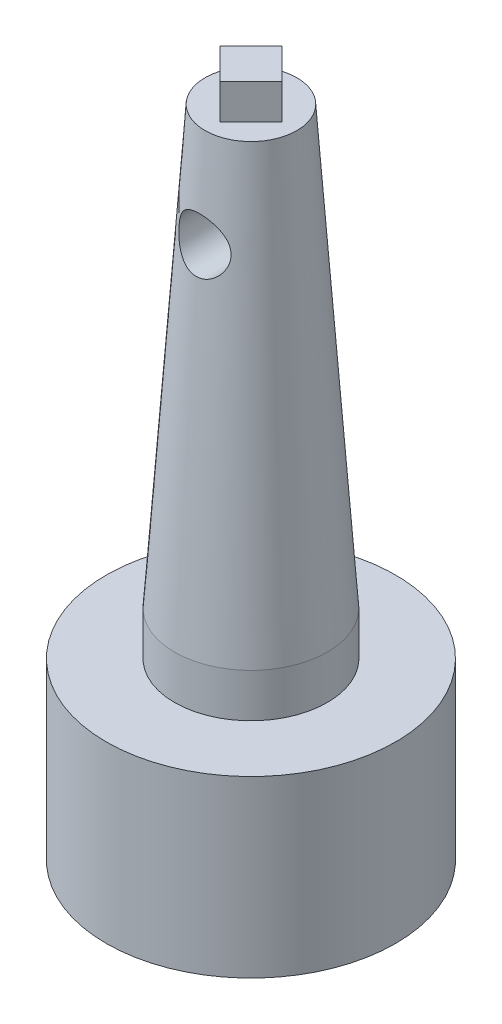
ISO-10303-21;
HEADER;
FILE_DESCRIPTION(('STEP AP214'),'2;1');
FILE_NAME('part.step','',(''),(''),'','','');
FILE_SCHEMA(('AUTOMOTIVE_DESIGN { 1 0 10303 214 1 1 1 1 }'));
ENDSEC;
DATA;
#1=APPLICATION_CONTEXT('core data for automotive mechanical design processes');
#2=APPLICATION_PROTOCOL_DEFINITION('international standard','automotive_design',2000,#1);
#3=PRODUCT_CONTEXT('',#1,'mechanical');
#4=PRODUCT('Part','Part','',(#3));
#5=PRODUCT_RELATED_PRODUCT_CATEGORY('part','',(#4));
#6=PRODUCT_DEFINITION_FORMATION('','',#4);
#7=PRODUCT_DEFINITION_CONTEXT('part definition',#1,'design');
#8=PRODUCT_DEFINITION('design','',#6,#7);
#9=PRODUCT_DEFINITION_SHAPE('','',#8);
#10=(LENGTH_UNIT() NAMED_UNIT(*) SI_UNIT(.MILLI.,.METRE.));
#11=(NAMED_UNIT(*) PLANE_ANGLE_UNIT() SI_UNIT($,.RADIAN.));
#12=(NAMED_UNIT(*) SI_UNIT($,.STERADIAN.) SOLID_ANGLE_UNIT());
#13=UNCERTAINTY_MEASURE_WITH_UNIT(LENGTH_MEASURE(1.E-05),#10,'distance_accuracy_value','');
#14=(GEOMETRIC_REPRESENTATION_CONTEXT(3) GLOBAL_UNCERTAINTY_ASSIGNED_CONTEXT((#13)) GLOBAL_UNIT_ASSIGNED_CONTEXT((#10,
#11,#12)) REPRESENTATION_CONTEXT('',''));
#15=CARTESIAN_POINT('',(0.,0.,0.));
#16=DIRECTION('',(0.,0.,1.));
#17=DIRECTION('',(1.,0.,0.));
#18=AXIS2_PLACEMENT_3D('',#15,#16,#17);
#19=CARTESIAN_POINT('',(0.,40.,0.));
#20=DIRECTION('',(0.,-1.,0.));
#21=DIRECTION('',(0.,0.,-1.));
#22=AXIS2_PLACEMENT_3D('',#19,#20,#21);
#23=CYLINDRICAL_SURFACE('',#22,33.14);
#24=CARTESIAN_POINT('',(0.,40.,0.));
#25=DIRECTION('',(0.,1.,0.));
#26=DIRECTION('',(0.,0.,1.));
#27=AXIS2_PLACEMENT_3D('',#24,#25,#26);
#28=CIRCLE('',#27,33.14);
#29=CARTESIAN_POINT('',(0.,40.,33.14));
#30=VERTEX_POINT('',#29);
#31=EDGE_CURVE('E11',#30,#30,#28,.T.);
#32=ORIENTED_EDGE('',*,*,#31,.F.);
#33=EDGE_LOOP('',(#32));
#34=FACE_BOUND('',#33,.T.);
#35=CARTESIAN_POINT('',(0.,0.,0.));
#36=DIRECTION('',(0.,1.,0.));
#37=DIRECTION('',(0.,0.,1.));
#38=AXIS2_PLACEMENT_3D('',#35,#36,#37);
#39=CIRCLE('',#38,33.14);
#40=CARTESIAN_POINT('',(0.,0.,33.14));
#41=VERTEX_POINT('',#40);
#42=EDGE_CURVE('E49',#41,#41,#39,.T.);
#43=ORIENTED_EDGE('',*,*,#42,.T.);
#44=EDGE_LOOP('',(#43));
#45=FACE_BOUND('',#44,.T.);
#46=ADVANCED_FACE('F36',(#34,#45),#23,.T.);
#47=CARTESIAN_POINT('',(0.,40.,0.));
#48=DIRECTION('',(0.,1.,0.));
#49=DIRECTION('',(0.,0.,1.));
#50=AXIS2_PLACEMENT_3D('',#47,#48,#49);
#51=PLANE('',#50);
#52=CARTESIAN_POINT('',(0.,40.,0.));
#53=DIRECTION('',(0.,1.,0.));
#54=DIRECTION('',(0.,0.,1.));
#55=AXIS2_PLACEMENT_3D('',#52,#53,#54);
#56=CIRCLE('',#55,17.5);
#57=CARTESIAN_POINT('',(0.,40.,17.5));
#58=VERTEX_POINT('',#57);
#59=EDGE_CURVE('E114',#58,#58,#56,.T.);
#60=ORIENTED_EDGE('',*,*,#59,.F.);
#61=EDGE_LOOP('',(#60));
#62=FACE_BOUND('',#61,.T.);
#63=ORIENTED_EDGE('',*,*,#31,.T.);
#64=EDGE_LOOP('',(#63));
#65=FACE_BOUND('',#64,.T.);
#66=ADVANCED_FACE('F155',(#62,#65),#51,.T.);
#67=CARTESIAN_POINT('',(0.,0.,0.));
#68=DIRECTION('',(0.,1.,0.));
#69=DIRECTION('',(1.,0.,0.));
#70=AXIS2_PLACEMENT_3D('',#67,#68,#69);
#71=SPHERICAL_SURFACE('',#70,33.14);
#72=ORIENTED_EDGE('',*,*,#42,.F.);
#73=EDGE_LOOP('',(#72));
#74=FACE_BOUND('',#73,.T.);
#75=ADVANCED_FACE('F160',(#74),#71,.F.);
#76=CARTESIAN_POINT('',(0.,-0.002000000000002,0.));
#77=DIRECTION('',(0.,1.,0.));
#78=DIRECTION('',(0.,0.,1.));
#79=AXIS2_PLACEMENT_3D('',#76,#77,#78);
#80=CYLINDRICAL_SURFACE('',#79,17.5);
#81=ORIENTED_EDGE('',*,*,#59,.T.);
#82=EDGE_LOOP('',(#81));
#83=FACE_BOUND('',#82,.T.);
#84=CARTESIAN_POINT('',(0.,50.,0.));
#85=DIRECTION('',(0.,1.,0.));
#86=DIRECTION('',(0.,0.,1.));
#87=AXIS2_PLACEMENT_3D('',#84,#85,#86);
#88=CIRCLE('',#87,17.5);
#89=CARTESIAN_POINT('',(0.,50.,17.5));
#90=VERTEX_POINT('',#89);
#91=EDGE_CURVE('E106',#90,#90,#88,.T.);
#92=ORIENTED_EDGE('',*,*,#91,.F.);
#93=EDGE_LOOP('',(#92));
#94=FACE_BOUND('',#93,.T.);
#95=ADVANCED_FACE('F151',(#83,#94),#80,.T.);
#96=CARTESIAN_POINT('',(0.,50.,0.));
#97=DIRECTION('',(0.,-1.,0.));
#98=DIRECTION('',(0.,0.,1.));
#99=AXIS2_PLACEMENT_3D('',#96,#97,#98);
#100=CONICAL_SURFACE('',#99,17.5,0.0698131700797732);
#101=CARTESIAN_POINT('',(-4.43018311927969,124.047940024082,-11.4981185183558));
#102=CARTESIAN_POINT('',(-4.21073559248368,123.798132972739,-11.6013875806402));
#103=CARTESIAN_POINT('',(-3.97022466613334,123.566076499891,-11.7037941893067));
#104=CARTESIAN_POINT('',(-3.45097271458993,123.142821609395,-11.8980823101804));
#105=CARTESIAN_POINT('',(-3.17217410149361,122.951685869632,-11.9899475778646));
#106=CARTESIAN_POINT('',(-2.72927569503452,122.70031611798,-12.113599200864));
#107=CARTESIAN_POINT('',(-2.5770652888357,122.622246723629,-12.1525476624292));
#108=CARTESIAN_POINT('',(-2.2654374033476,122.478924228766,-12.2246651444194));
#109=CARTESIAN_POINT('',(-2.10602315775809,122.413665446693,-12.2578367261747));
#110=CARTESIAN_POINT('',(-1.7812037497238,122.296794342125,-12.3174884237892));
#111=CARTESIAN_POINT('',(-1.61580353184301,122.24517103627,-12.343973924513));
#112=CARTESIAN_POINT('',(-1.28020591579924,122.156214282065,-12.3895299784509));
#113=CARTESIAN_POINT('',(-1.11000907388733,122.118879184014,-12.4086013876925));
#114=CARTESIAN_POINT('',(-0.781442663501435,122.061694429336,-12.4374241228269));
#115=CARTESIAN_POINT('',(-0.623348266304433,122.040596402695,-12.4478472573004));
#116=CARTESIAN_POINT('',(-0.305682799581043,122.011042245575,-12.4617623036499));
#117=CARTESIAN_POINT('',(-0.14611184389465,122.002585148543,-12.4652547454695));
#118=CARTESIAN_POINT('',(0.173158654936147,121.998430893762,-12.4651986146649));
#119=CARTESIAN_POINT('',(0.332858162580136,122.002730962161,-12.4616515727251));
#120=CARTESIAN_POINT('',(0.651095594138211,122.024024448348,-12.4475903108619));
#121=CARTESIAN_POINT('',(0.809633553593091,122.041017476108,-12.4370763050199));
#122=CARTESIAN_POINT('',(1.11313564629887,122.085816113205,-12.4103122499686));
#123=CARTESIAN_POINT('',(1.2582669079616,122.112772198035,-12.3945203672401));
#124=CARTESIAN_POINT('',(1.54552197419558,122.177145223612,-12.3574517569853));
#125=CARTESIAN_POINT('',(1.6876448137705,122.214565467794,-12.3361732975641));
#126=CARTESIAN_POINT('',(1.96793457495759,122.299457904298,-12.2885622900804));
#127=CARTESIAN_POINT('',(2.10610260576038,122.346927246195,-12.2622311753995));
#128=CARTESIAN_POINT('',(2.37782491483698,122.451488366365,-12.2050022820996));
#129=CARTESIAN_POINT('',(2.51137737649492,122.508583882527,-12.1741027301098));
#130=CARTESIAN_POINT('',(2.7794843788718,122.634873865146,-12.1067165702524));
#131=CARTESIAN_POINT('',(2.91377735939848,122.704518624279,-12.070032544399));
#132=CARTESIAN_POINT('',(3.17592803999881,122.853269265847,-11.992962050188));
#133=CARTESIAN_POINT('',(3.30378351880524,122.932378382611,-11.9525743172414));
#134=CARTESIAN_POINT('',(3.67685543621524,123.1830481364,-11.8269481925208));
#135=CARTESIAN_POINT('',(3.911705898397,123.36801226569,-11.7372135029268));
#136=CARTESIAN_POINT('',(4.37559543857931,123.792787999697,-11.5411350044579));
#137=CARTESIAN_POINT('',(4.6007898909787,124.036475077642,-11.4340727329308));
#138=CARTESIAN_POINT('',(4.90632744759103,124.427482235784,-11.2747964186743));
#139=CARTESIAN_POINT('',(5.00285993823301,124.562178429875,-11.2218833011104));
#140=CARTESIAN_POINT('',(5.18472027375542,124.839596825431,-11.1176264531438));
#141=CARTESIAN_POINT('',(5.27004632978182,124.98232030309,-11.0662829742996));
#142=CARTESIAN_POINT('',(5.43402434797292,125.284577039565,-10.9631609319515));
#143=CARTESIAN_POINT('',(5.51189061988297,125.444600742747,-10.9115679889128));
#144=CARTESIAN_POINT('',(5.65349960426898,125.772080470128,-10.8130408902593));
#145=CARTESIAN_POINT('',(5.71724897958029,125.939532943139,-10.7661045426422));
#146=CARTESIAN_POINT('',(5.82985776785401,126.280803455469,-10.678365240841));
#147=CARTESIAN_POINT('',(5.87872812907922,126.454616708395,-10.6375577881568));
#148=CARTESIAN_POINT('',(5.96086660192151,126.807451257228,-10.5634298931085));
#149=CARTESIAN_POINT('',(5.9941372393062,126.986471705042,-10.5301082391663));
#150=CARTESIAN_POINT('',(6.04206450064619,127.331359668241,-10.4748380588139));
#151=CARTESIAN_POINT('',(6.05816332292635,127.496903916347,-10.4521205084956));
#152=CARTESIAN_POINT('',(6.07658891532129,127.829643808885,-10.4144901174232));
#153=CARTESIAN_POINT('',(6.0789165942709,127.99683934361,-10.3995767616859));
#154=CARTESIAN_POINT('',(6.06960708256829,128.331269481667,-10.3779303143371));
#155=CARTESIAN_POINT('',(6.0579785144845,128.498503997119,-10.3711921770121));
#156=CARTESIAN_POINT('',(6.02079582956152,128.831541062499,-10.3658993774439));
#157=CARTESIAN_POINT('',(5.99524270874028,128.997343713987,-10.3673441299511));
#158=CARTESIAN_POINT('',(5.93426626527174,129.306708290312,-10.3774431975523));
#159=CARTESIAN_POINT('',(5.90035070698604,129.450599407305,-10.3852327150515));
#160=CARTESIAN_POINT('',(5.82214989866593,129.735156397323,-10.4064799927191));
#161=CARTESIAN_POINT('',(5.7778612493861,129.875821196464,-10.419939612128));
#162=CARTESIAN_POINT('',(5.67930632195236,130.152985027352,-10.4519295795277));
#163=CARTESIAN_POINT('',(5.62504145516178,130.289484645179,-10.4704592104306));
#164=CARTESIAN_POINT('',(5.50693986685151,130.557642328649,-10.5118899189422));
#165=CARTESIAN_POINT('',(5.44309941444535,130.68929848215,-10.5347927013933));
#166=CARTESIAN_POINT('',(5.30329286047183,130.952759775901,-10.5852801558323));
#167=CARTESIAN_POINT('',(5.22691697950042,131.084316855838,-10.6130264280576));
#168=CARTESIAN_POINT('',(5.06475377232466,131.340796610155,-10.6715174210446));
#169=CARTESIAN_POINT('',(4.97896328591894,131.465717035798,-10.7022631482468));
#170=CARTESIAN_POINT('',(4.70812117091173,131.829768860132,-10.7976326521644));
#171=CARTESIAN_POINT('',(4.50953941216434,132.058302369856,-10.8654114612557));
#172=CARTESIAN_POINT('',(4.17574839579356,132.388540783482,-10.9717377010827));
#173=CARTESIAN_POINT('',(4.05137174156515,132.501624837259,-11.0099508597093));
#174=CARTESIAN_POINT('',(3.79339766715091,132.717049318047,-11.0855534886071));
#175=CARTESIAN_POINT('',(3.65980291619347,132.819392833672,-11.1229431932183));
#176=CARTESIAN_POINT('',(3.38403444351233,133.012726086905,-11.1958013316069));
#177=CARTESIAN_POINT('',(3.24185595808406,133.103709432432,-11.2312686774266));
#178=CARTESIAN_POINT('',(2.94983148649186,133.273566088008,-11.2992017897531));
#179=CARTESIAN_POINT('',(2.79998886184879,133.352444647556,-11.3316688549512));
#180=CARTESIAN_POINT('',(2.49152826584715,133.498394094987,-11.3930431548877));
#181=CARTESIAN_POINT('',(2.33282282175936,133.56530176334,-11.4218997717974));
#182=CARTESIAN_POINT('',(2.00956570471227,133.685368375414,-11.4746592918308));
#183=CARTESIAN_POINT('',(1.84501658074702,133.73853323192,-11.4985643244701));
#184=CARTESIAN_POINT('',(1.51130630339086,133.830540961827,-11.5406759068674));
#185=CARTESIAN_POINT('',(1.34214682752967,133.869388971791,-11.5588845000251));
#186=CARTESIAN_POINT('',(1.00055549829621,133.932309130005,-11.5890322515458));
#187=CARTESIAN_POINT('',(0.828123936736995,133.956382589562,-11.6009719662862));
#188=CARTESIAN_POINT('',(0.495374794213974,133.988120130966,-11.6175180827577));
#189=CARTESIAN_POINT('',(0.335192068423495,133.996943226798,-11.6226348795514));
#190=CARTESIAN_POINT('',(0.0145564894320367,134.001723300865,-11.6271234560717));
#191=CARTESIAN_POINT('',(-0.145896352240092,133.997680814967,-11.6264954750729));
#192=CARTESIAN_POINT('',(-0.465815939078724,133.976778087199,-11.6195390078705));
#193=CARTESIAN_POINT('',(-0.625282810112611,133.959919516952,-11.6132112650763));
#194=CARTESIAN_POINT('',(-0.942051773388804,133.913577160773,-11.5950667694413));
#195=CARTESIAN_POINT('',(-1.09935386728659,133.884093384496,-11.5832500207982));
#196=CARTESIAN_POINT('',(-1.40522601522624,133.814062673967,-11.5549948676314));
#197=CARTESIAN_POINT('',(-1.55390926802046,133.773937486059,-11.5387320399881));
#198=CARTESIAN_POINT('',(-1.84732050350019,133.682583991379,-11.5018772874439));
#199=CARTESIAN_POINT('',(-1.99204717948555,133.631352065208,-11.4812839514078));
#200=CARTESIAN_POINT('',(-2.27663530410905,133.518232961349,-11.4363209872401));
#201=CARTESIAN_POINT('',(-2.41649773844479,133.45634795772,-11.4119521297103));
#202=CARTESIAN_POINT('',(-2.69066629684865,133.322384604247,-11.3600675497925));
#203=CARTESIAN_POINT('',(-2.82497038408076,133.250302559744,-11.3325506874929));
#204=CARTESIAN_POINT('',(-3.23390361761907,133.010446071964,-11.2429272548991));
#205=CARTESIAN_POINT('',(-3.49784472134419,132.825662504237,-11.1764931414869));
#206=CARTESIAN_POINT('',(-3.99251907610382,132.416913174622,-11.0398926307856));
#207=CARTESIAN_POINT('',(-4.22322976888175,132.192921022617,-10.9697237420107));
#208=CARTESIAN_POINT('',(-4.54836113809761,131.822363909255,-10.8654428019121));
#209=CARTESIAN_POINT('',(-4.65640784994565,131.687999089761,-10.8296855803712));
#210=CARTESIAN_POINT('',(-4.86081600769238,131.410050903271,-10.7608200991121));
#211=CARTESIAN_POINT('',(-4.95718214088853,131.2664712697,-10.7277107786449));
#212=CARTESIAN_POINT('',(-5.13749759535808,130.970869295435,-10.6654836183469));
#213=CARTESIAN_POINT('',(-5.22144554605997,130.818846025375,-10.6363662191229));
#214=CARTESIAN_POINT('',(-5.37609858467498,130.507399564796,-10.5834734247126));
#215=CARTESIAN_POINT('',(-5.44681091897266,130.347980483432,-10.559695104995));
#216=CARTESIAN_POINT('',(-5.57165097065862,130.029541248666,-10.5195490310035));
#217=CARTESIAN_POINT('',(-5.62634249339461,129.870775914487,-10.5029160454464));
#218=CARTESIAN_POINT('',(-5.72227101259685,129.548740777481,-10.4766276889948));
#219=CARTESIAN_POINT('',(-5.76351490177528,129.385473328948,-10.4669687403986));
#220=CARTESIAN_POINT('',(-5.83208517269462,129.055883457894,-10.4553159615169));
#221=CARTESIAN_POINT('',(-5.85942115301497,128.88956322462,-10.4533168385429));
#222=CARTESIAN_POINT('',(-5.89993228564413,128.555310342843,-10.4573510630232));
#223=CARTESIAN_POINT('',(-5.91310882115365,128.387377853455,-10.4633836257533));
#224=CARTESIAN_POINT('',(-5.92456934924446,128.070480889589,-10.4823591881535));
#225=CARTESIAN_POINT('',(-5.92436754604184,127.921516719129,-10.4944445577637));
#226=CARTESIAN_POINT('',(-5.91290697518498,127.624593238485,-10.5247278237569));
#227=CARTESIAN_POINT('',(-5.90164465142896,127.476634266891,-10.5429276847906));
#228=CARTESIAN_POINT('',(-5.86829351154575,127.182735460413,-10.5850320206431));
#229=CARTESIAN_POINT('',(-5.84620255095941,127.036796031359,-10.6089376249228));
#230=CARTESIAN_POINT('',(-5.79153501795798,126.747821462503,-10.6618799052542));
#231=CARTESIAN_POINT('',(-5.75895446532096,126.604787447082,-10.690918527114));
#232=CARTESIAN_POINT('',(-5.64476319717091,126.176417642261,-10.7858087411121));
#233=CARTESIAN_POINT('',(-5.54727114025813,125.896718062783,-10.8587007447767));
#234=CARTESIAN_POINT('',(-5.31412932353214,125.357895221359,-11.0165130641291));
#235=CARTESIAN_POINT('',(-5.17851303316342,125.098754165709,-11.1014227970755));
#236=CARTESIAN_POINT('',(-4.93747415208587,124.709382278475,-11.2395323852161));
#237=CARTESIAN_POINT('',(-4.84369056411338,124.571145798317,-11.2908837051731));
#238=CARTESIAN_POINT('',(-4.64510069470387,124.303096055313,-11.3942685270002));
#239=CARTESIAN_POINT('',(-4.54029341502531,124.173283557018,-11.4463020902761));
#240=CARTESIAN_POINT('',(-4.43018311927969,124.047940024082,-11.4981185183558));
#241=B_SPLINE_CURVE_WITH_KNOTS('',3,(#101,#102,#103,#104,#105,#106,#107,#108,#109,#110,#111,
#112,#113,#114,#115,#116,#117,#118,#119,#120,#121,#122,#123,#124,#125,#126,#127,#128,#129,#130,
#131,#132,#133,#134,#135,#136,#137,#138,#139,#140,#141,#142,#143,#144,#145,#146,#147,#148,#149,
#150,#151,#152,#153,#154,#155,#156,#157,#158,#159,#160,#161,#162,#163,#164,#165,#166,#167,#168,
#169,#170,#171,#172,#173,#174,#175,#176,#177,#178,#179,#180,#181,#182,#183,#184,#185,#186,#187,
#188,#189,#190,#191,#192,#193,#194,#195,#196,#197,#198,#199,#200,#201,#202,#203,#204,#205,#206,
#207,#208,#209,#210,#211,#212,#213,#214,#215,#216,#217,#218,#219,#220,#221,#222,#223,#224,#225,
#226,#227,#228,#229,#230,#231,#232,#233,#234,#235,#236,#237,#238,#239,#240),.UNSPECIFIED.,.T.,
.F.,(4,2,2,2,2,2,2,2,2,2,2,2,2,2,2,2,2,2,2,2,2,2,2,2,2,2,2,2,2,2,2,2,2,2,2,2,2,2,2,2,2,2,2,2,2,
2,2,2,2,2,2,2,2,2,2,2,2,2,2,2,2,2,2,2,2,2,2,2,2,4),(0.,1.0439730190382,2.08953381888457,
2.6152647070494,3.14076190196325,3.66583450966424,4.19084647470867,4.66971632962054,
5.14854956714825,5.62727869728983,6.10599311769163,6.55085751991352,6.99586252048213,
7.440741464261,7.88579355625813,8.35228163297325,8.81892958407072,9.75179154532539,
10.7930256255636,11.3144521575406,11.8359618225775,12.3911157469968,12.9460070910112,
13.5004891430582,14.0548813873086,14.55776632361,15.0606180713493,15.5631593027677,
16.0656645923216,16.5092767964997,16.953034575589,17.3967296232709,17.8405979968215,
18.3039860744619,18.7675301761673,19.6942367977295,20.2109467893127,20.7275077831696,
21.2443581355229,21.7609837074401,22.2841906106955,22.8071720303052,23.3299656328172,
23.8527128283478,24.3336263476123,24.8145198365392,25.2953506124907,25.7761810207138,
26.2402403206166,26.7044510734127,27.1685672031149,27.6328519272148,28.6153394811282,
29.5984908785463,30.1262015767392,30.6536998039395,31.1812562067619,31.7085229267661,
32.2140393375948,32.719296232373,33.2242039481604,33.7290623362922,34.1768887578487,
34.6248592085992,35.0729184094566,35.5211478248483,36.432409688674,37.3428740364104,
37.8666519168018,38.3904772683793),.UNSPECIFIED.);
#242=CARTESIAN_POINT('',(-4.43018311927969,124.047940024082,-11.4981185183558));
#243=VERTEX_POINT('',#242);
#244=EDGE_CURVE('E39',#243,#243,#241,.T.);
#245=ORIENTED_EDGE('',*,*,#244,.T.);
#246=EDGE_LOOP('',(#245));
#247=FACE_BOUND('',#246,.T.);
#248=CARTESIAN_POINT('',(-4.5206831917196,123.960268510891,11.4694287574574));
#249=CARTESIAN_POINT('',(-4.74727946757124,124.209989718339,11.3613399440523));
#250=CARTESIAN_POINT('',(-4.95278461019625,124.478951147252,11.2518878350782));
#251=CARTESIAN_POINT('',(-5.22568129513943,124.906796760743,11.0932478849344));
#252=CARTESIAN_POINT('',(-5.3108497783843,125.053706993082,11.0412204735028));
#253=CARTESIAN_POINT('',(-5.46883126075074,125.355135769503,10.9402684336437));
#254=CARTESIAN_POINT('',(-5.54164385861542,125.509654560463,10.8913439060146));
#255=CARTESIAN_POINT('',(-5.67455220675421,125.826277905836,10.7976905850571));
#256=CARTESIAN_POINT('',(-5.7345820650257,125.988416744853,10.7529841633989));
#257=CARTESIAN_POINT('',(-5.84075147732671,126.318562039192,10.6693762166317));
#258=CARTESIAN_POINT('',(-5.88689797386852,126.486565514778,10.6304717950999));
#259=CARTESIAN_POINT('',(-5.96459925555366,126.82714372159,10.5597271723922));
#260=CARTESIAN_POINT('',(-5.99617310762411,126.999712165431,10.5278777689476));
#261=CARTESIAN_POINT('',(-6.04420414989797,127.348221093437,10.4722487255739));
#262=CARTESIAN_POINT('',(-6.06066361380924,127.524161066344,10.4484678722053));
#263=CARTESIAN_POINT('',(-6.07716909445893,127.860307628586,10.4116652960315));
#264=CARTESIAN_POINT('',(-6.07867500413999,128.02035282011,10.3978132073837));
#265=CARTESIAN_POINT('',(-6.06889217310095,128.340523822214,10.3775988512166));
#266=CARTESIAN_POINT('',(-6.05760429426212,128.500649626638,10.3712360792222));
#267=CARTESIAN_POINT('',(-6.02226028496402,128.819593785238,10.3660136158772));
#268=CARTESIAN_POINT('',(-5.99820509228934,128.978412234572,10.367153373521));
#269=CARTESIAN_POINT('',(-5.93754129903956,129.29340515346,10.3766460236577));
#270=CARTESIAN_POINT('',(-5.90093298685925,129.449579683669,10.3849987504469));
#271=CARTESIAN_POINT('',(-5.81907136278075,129.745272950456,10.4073912970091));
#272=CARTESIAN_POINT('',(-5.77478411375702,129.885100531948,10.4209033085176));
#273=CARTESIAN_POINT('',(-5.67633883815959,130.160664665538,10.452930206046));
#274=CARTESIAN_POINT('',(-5.62217751993461,130.296399835739,10.4714467613928));
#275=CARTESIAN_POINT('',(-5.44550874194571,130.696272871529,10.5334756494438));
#276=CARTESIAN_POINT('',(-5.30876223795658,130.953272415055,10.5834835265548));
#277=CARTESIAN_POINT('',(-4.98876883665318,131.462607318843,10.69894671679));
#278=CARTESIAN_POINT('',(-4.80267864673707,131.712927648526,10.7653173021776));
#279=CARTESIAN_POINT('',(-4.39461571946459,132.181237317731,10.9029381791445));
#280=CARTESIAN_POINT('',(-4.17262273118944,132.399208276795,10.9741912115117));
#281=CARTESIAN_POINT('',(-3.80418910941988,132.708632327432,11.0825061700165));
#282=CARTESIAN_POINT('',(-3.66860908541131,132.812932217611,11.1205480934575));
#283=CARTESIAN_POINT('',(-3.38866356216619,133.009754133961,11.1946435714073));
#284=CARTESIAN_POINT('',(-3.24430119544216,133.102280323625,11.2306978262381));
#285=CARTESIAN_POINT('',(-2.94755869720861,133.274894887962,11.299732523376));
#286=CARTESIAN_POINT('',(-2.79517592175956,133.35497912631,11.3327119420034));
#287=CARTESIAN_POINT('',(-2.48344924240942,133.501947056997,11.3945610553844));
#288=CARTESIAN_POINT('',(-2.32410872147618,133.56883707918,11.4234327189464));
#289=CARTESIAN_POINT('',(-2.00281810558005,133.687564537464,11.4756456573626));
#290=CARTESIAN_POINT('',(-1.84098793776305,133.739681723808,11.4990879185957));
#291=CARTESIAN_POINT('',(-1.51281337935776,133.830087413622,11.5404704014137));
#292=CARTESIAN_POINT('',(-1.34646901108842,133.868375985451,11.5584106501961));
#293=CARTESIAN_POINT('',(-1.01067683646984,133.930652444413,11.5882274293718));
#294=CARTESIAN_POINT('',(-0.841230731635255,133.95464794348,11.6001071868616));
#295=CARTESIAN_POINT('',(-0.500585720527289,133.988063920507,11.6174527911848));
#296=CARTESIAN_POINT('',(-0.329386944581806,133.997485474369,11.6229191114741));
#297=CARTESIAN_POINT('',(-0.000646302199879277,134.001466819435,11.6271115714853));
#298=CARTESIAN_POINT('',(0.156876523667946,133.997170503978,11.6263486377922));
#299=CARTESIAN_POINT('',(0.471031229123698,133.976219246874,11.6193288104406));
#300=CARTESIAN_POINT('',(0.627662783454364,133.959560052747,11.6130700262294));
#301=CARTESIAN_POINT('',(0.938772421189893,133.914068166968,11.5952595098519));
#302=CARTESIAN_POINT('',(1.09325135921936,133.885240457404,11.583709943696));
#303=CARTESIAN_POINT('',(1.39910656033247,133.8156999161,11.5556581769485));
#304=CARTESIAN_POINT('',(1.55048161964345,133.774982563154,11.539154092263));
#305=CARTESIAN_POINT('',(1.84757050153372,133.682527929437,11.5018542403889));
#306=CARTESIAN_POINT('',(1.99332629132697,133.630907157737,11.4811039145078));
#307=CARTESIAN_POINT('',(2.27994802670539,133.516851628845,11.4357751679761));
#308=CARTESIAN_POINT('',(2.42081219618863,133.454412992066,11.4111953742918));
#309=CARTESIAN_POINT('',(2.83484727914395,133.251579302937,11.3326595395233));
#310=CARTESIAN_POINT('',(3.09966337915071,133.095602881821,11.2738802299288));
#311=CARTESIAN_POINT('',(3.61981574676462,132.733462150918,11.1448839077275));
#312=CARTESIAN_POINT('',(3.87302201099445,132.524450173189,11.0741436125557));
#313=CARTESIAN_POINT('',(4.3424941529434,132.067736178356,10.9329747837712));
#314=CARTESIAN_POINT('',(4.5587354488466,131.820008623233,10.8625464877234));
#315=CARTESIAN_POINT('',(4.85655766354258,131.416249601426,10.7622777411155));
#316=CARTESIAN_POINT('',(4.95350354956403,131.272167469609,10.7289774415085));
#317=CARTESIAN_POINT('',(5.13485876127951,130.975517966155,10.6663970175945));
#318=CARTESIAN_POINT('',(5.21927371865123,130.822954448874,10.6371150877925));
#319=CARTESIAN_POINT('',(5.37474810496395,130.510378407016,10.5839293770543));
#320=CARTESIAN_POINT('',(5.44581523296918,130.350370243403,10.5600224941984));
#321=CARTESIAN_POINT('',(5.57388389620313,130.023993902041,10.51882385768));
#322=CARTESIAN_POINT('',(5.63088717693137,129.857626516514,10.5015312829522));
#323=CARTESIAN_POINT('',(5.72639945067258,129.532664879328,10.4756428158517));
#324=CARTESIAN_POINT('',(5.76597814246409,129.374429139328,10.4664899338186));
#325=CARTESIAN_POINT('',(5.83209630907947,129.0550044481,10.4553765170476));
#326=CARTESIAN_POINT('',(5.85863648753002,128.893815656722,10.453415594157));
#327=CARTESIAN_POINT('',(5.89841000008856,128.56996550307,10.4570326876812));
#328=CARTESIAN_POINT('',(5.91164967440486,128.407304879752,10.4626071091025));
#329=CARTESIAN_POINT('',(5.92478942613733,128.081888908981,10.4813190260775));
#330=CARTESIAN_POINT('',(5.92469017718113,127.919133566727,10.4944561396751));
#331=CARTESIAN_POINT('',(5.91194762657148,127.610512841485,10.5263960959383));
#332=CARTESIAN_POINT('',(5.90051036700523,127.464527003247,10.5445333714046));
#333=CARTESIAN_POINT('',(5.86710737597109,127.174549401713,10.5863430922677));
#334=CARTESIAN_POINT('',(5.8451381286442,127.030558320847,10.6100173847162));
#335=CARTESIAN_POINT('',(5.76388862047833,126.602930809742,10.6885536925431));
#336=CARTESIAN_POINT('',(5.68925786892222,126.323444229913,10.7509504651109));
#337=CARTESIAN_POINT('',(5.49674120855975,125.765442772906,10.8944242496824));
#338=CARTESIAN_POINT('',(5.37655512735514,125.487965931131,10.9763887885833));
#339=CARTESIAN_POINT('',(5.09754801009047,124.956249177354,11.1496012291919));
#340=CARTESIAN_POINT('',(4.93870593658216,124.702022022347,11.2408541700689));
#341=CARTESIAN_POINT('',(4.56148993709198,124.187521490906,11.438380421692));
#342=CARTESIAN_POINT('',(4.33794876685287,123.931162497963,11.5450033173214));
#343=CARTESIAN_POINT('',(3.84909349382107,123.458172057725,11.7518408128368));
#344=CARTESIAN_POINT('',(3.58375976999472,123.241559374718,11.8520523714555));
#345=CARTESIAN_POINT('',(3.1538778137302,122.948129115728,11.9921356825318));
#346=CARTESIAN_POINT('',(3.00254767508485,122.85432298715,12.0377737649492));
#347=CARTESIAN_POINT('',(2.69103333938494,122.679940675653,12.1237042629026));
#348=CARTESIAN_POINT('',(2.53085326522706,122.599358400489,12.1639991384081));
#349=CARTESIAN_POINT('',(2.20277951860026,122.452391626333,12.2381083376048));
#350=CARTESIAN_POINT('',(2.03489031039243,122.385999033158,12.2719263547226));
#351=CARTESIAN_POINT('',(1.69262232301957,122.268258577075,12.3321052199619));
#352=CARTESIAN_POINT('',(1.51824451362665,122.216908476048,12.3584671774243));
#353=CARTESIAN_POINT('',(1.18294834775973,122.134558595449,12.4005886570364));
#354=CARTESIAN_POINT('',(1.02251443904666,122.101998565717,12.4171652882848));
#355=CARTESIAN_POINT('',(0.698966188854598,122.050034061213,12.443211123838));
#356=CARTESIAN_POINT('',(0.535852150353354,122.030628109764,12.4526811259457));
#357=CARTESIAN_POINT('',(0.208408950889274,122.005257294371,12.4642356488486));
#358=CARTESIAN_POINT('',(0.0440804860290478,121.999285251522,12.4663241145819));
#359=CARTESIAN_POINT('',(-0.284433330107452,122.000850859144,12.4630468114995));
#360=CARTESIAN_POINT('',(-0.448618688944025,122.008387746451,12.4576814637791));
#361=CARTESIAN_POINT('',(-0.760258728149131,122.035534516445,12.4404608483739));
#362=CARTESIAN_POINT('',(-0.907854255899349,122.053961258178,12.4292528619873));
#363=CARTESIAN_POINT('',(-1.20077182902038,122.101625801653,12.4010334695548));
#364=CARTESIAN_POINT('',(-1.3460931412137,122.130867017937,12.3840202307016));
#365=CARTESIAN_POINT('',(-1.63346800957052,122.199835075724,12.3445360220439));
#366=CARTESIAN_POINT('',(-1.77552158204186,122.239561864887,12.3220650794829));
#367=CARTESIAN_POINT('',(-2.05553543800351,122.329083951486,12.2721152623562));
#368=CARTESIAN_POINT('',(-2.19349419143582,122.378882959491,12.2446345425758));
#369=CARTESIAN_POINT('',(-2.6070935871167,122.545543152777,12.1538944177017));
#370=CARTESIAN_POINT('',(-2.87508485759037,122.67788762634,12.0833815995833));
#371=CARTESIAN_POINT('',(-3.38515073482511,122.978533564646,11.9286846071531));
#372=CARTESIAN_POINT('',(-3.6272486138827,123.146802326959,11.8445128833593));
#373=CARTESIAN_POINT('',(-3.97397167628739,123.42741529193,11.7101823084566));
#374=CARTESIAN_POINT('',(-4.08920268348452,123.528279029007,11.6628935178448));
#375=CARTESIAN_POINT('',(-4.31128964777932,123.738204889884,11.5669724356321));
#376=CARTESIAN_POINT('',(-4.41814579900004,123.847266823541,11.5183401752071));
#377=CARTESIAN_POINT('',(-4.5206831917196,123.960268510891,11.4694287574574));
#378=B_SPLINE_CURVE_WITH_KNOTS('',3,(#248,#249,#250,#251,#252,#253,#254,#255,#256,#257,#258,
#259,#260,#261,#262,#263,#264,#265,#266,#267,#268,#269,#270,#271,#272,#273,#274,#275,#276,#277,
#278,#279,#280,#281,#282,#283,#284,#285,#286,#287,#288,#289,#290,#291,#292,#293,#294,#295,#296,
#297,#298,#299,#300,#301,#302,#303,#304,#305,#306,#307,#308,#309,#310,#311,#312,#313,#314,#315,
#316,#317,#318,#319,#320,#321,#322,#323,#324,#325,#326,#327,#328,#329,#330,#331,#332,#333,#334,
#335,#336,#337,#338,#339,#340,#341,#342,#343,#344,#345,#346,#347,#348,#349,#350,#351,#352,#353,
#354,#355,#356,#357,#358,#359,#360,#361,#362,#363,#364,#365,#366,#367,#368,#369,#370,#371,#372,
#373,#374,#375,#376,#377),.UNSPECIFIED.,.T.,.F.,(4,2,2,2,2,2,2,2,2,2,2,2,2,2,2,2,2,2,2,2,2,2,2,
2,2,2,2,2,2,2,2,2,2,2,2,2,2,2,2,2,2,2,2,2,2,2,2,2,2,2,2,2,2,2,2,2,2,2,2,2,2,2,2,2,4),(0.,
1.0616578803882,1.59401256829621,2.12638454109447,2.66143767120201,3.19622279627497,
3.73030620802954,4.26430926266572,4.74559693847651,5.22685219322766,5.70807210371478,
6.18928095941934,6.63066940784749,7.07220526889839,7.95467702264866,8.90769057799825,
9.86124356605808,10.3864233009291,10.9114167990826,11.4365844594758,11.961499557845,
12.475684470908,12.9898668422202,13.5037751346527,14.0176454866991,14.489818910744,
14.9621548243988,15.4342975394924,15.9066200279487,16.3741300255382,16.8418080335751,
17.7765290769684,18.7800029417872,19.7841415454804,20.3140432470613,20.8437060733092,
21.3730624440067,21.9023530818631,22.3917725012625,22.8811655061167,23.3703251116956,
23.8594600142835,24.3016029896851,24.7438936671184,25.6278902196413,26.5642455927531,
27.5011116952945,28.5659024339447,29.6311945756177,30.1819639901139,30.7324789478427,
31.2826790337069,31.8327972155865,32.32574749624,32.8186424291263,33.3112739027308,
33.8038775467727,34.2508458107546,34.6979553202504,35.1450625979342,35.5923348893224,
36.5095836180943,37.4260008947754,37.9064243028749,38.3868365718147),.UNSPECIFIED.);
#379=CARTESIAN_POINT('',(-4.5206831917196,123.960268510891,11.4694287574574));
#380=VERTEX_POINT('',#379);
#381=EDGE_CURVE('E118',#380,#380,#378,.T.);
#382=ORIENTED_EDGE('',*,*,#381,.T.);
#383=EDGE_LOOP('',(#382));
#384=FACE_BOUND('',#383,.T.);
#385=CARTESIAN_POINT('',(0.,150.,0.));
#386=DIRECTION('',(0.,1.,0.));
#387=DIRECTION('',(0.,0.,1.));
#388=AXIS2_PLACEMENT_3D('',#385,#386,#387);
#389=CIRCLE('',#388,10.507318805649);
#390=CARTESIAN_POINT('',(0.,150.,10.507318805649));
#391=VERTEX_POINT('',#390);
#392=EDGE_CURVE('E103',#391,#391,#389,.T.);
#393=ORIENTED_EDGE('',*,*,#392,.F.);
#394=EDGE_LOOP('',(#393));
#395=FACE_BOUND('',#394,.T.);
#396=ORIENTED_EDGE('',*,*,#91,.T.);
#397=EDGE_LOOP('',(#396));
#398=FACE_BOUND('',#397,.T.);
#399=ADVANCED_FACE('F123',(#247,#384,#395,#398),#100,.T.);
#400=CARTESIAN_POINT('',(0.,150.,0.));
#401=DIRECTION('',(0.,1.,0.));
#402=DIRECTION('',(0.,0.,1.));
#403=AXIS2_PLACEMENT_3D('',#400,#401,#402);
#404=PLANE('',#403);
#405=DIRECTION('',(-0.707213546250353,0.,-0.707));
#406=VECTOR('',#405,1.);
#407=CARTESIAN_POINT('',(7.07213546250353,150.,0.));
#408=LINE('',#407,#406);
#409=CARTESIAN_POINT('',(7.07213546250353,150.,0.));
#410=VERTEX_POINT('',#409);
#411=CARTESIAN_POINT('',(0.,150.,-7.07));
#412=VERTEX_POINT('',#411);
#413=EDGE_CURVE('E57',#410,#412,#408,.T.);
#414=ORIENTED_EDGE('',*,*,#413,.F.);
#415=DIRECTION('',(0.707213546250353,0.,-0.707));
#416=VECTOR('',#415,1.);
#417=CARTESIAN_POINT('',(0.,150.,7.07));
#418=LINE('',#417,#416);
#419=CARTESIAN_POINT('',(0.,150.,7.07));
#420=VERTEX_POINT('',#419);
#421=EDGE_CURVE('E61',#420,#410,#418,.T.);
#422=ORIENTED_EDGE('',*,*,#421,.F.);
#423=DIRECTION('',(0.707213546250353,0.,0.707));
#424=VECTOR('',#423,1.);
#425=CARTESIAN_POINT('',(-7.07213546250353,150.,0.));
#426=LINE('',#425,#424);
#427=CARTESIAN_POINT('',(-7.07213546250353,150.,0.));
#428=VERTEX_POINT('',#427);
#429=EDGE_CURVE('E252',#428,#420,#426,.T.);
#430=ORIENTED_EDGE('',*,*,#429,.F.);
#431=DIRECTION('',(-0.707213546250353,0.,0.707));
#432=VECTOR('',#431,1.);
#433=CARTESIAN_POINT('',(0.,150.,-7.07));
#434=LINE('',#433,#432);
#435=EDGE_CURVE('E250',#412,#428,#434,.T.);
#436=ORIENTED_EDGE('',*,*,#435,.F.);
#437=EDGE_LOOP('',(#414,#422,#430,#436));
#438=FACE_BOUND('',#437,.T.);
#439=ORIENTED_EDGE('',*,*,#392,.T.);
#440=EDGE_LOOP('',(#439));
#441=FACE_BOUND('',#440,.T.);
#442=ADVANCED_FACE('F146',(#438,#441),#404,.T.);
#443=CARTESIAN_POINT('',(7.07213546250353,158.,0.));
#444=DIRECTION('',(-0.707,0.,0.707213546250353));
#445=DIRECTION('',(0.707213546250353,0.,0.707));
#446=AXIS2_PLACEMENT_3D('',#443,#444,#445);
#447=PLANE('',#446);
#448=ORIENTED_EDGE('',*,*,#413,.T.);
#449=DIRECTION('',(0.,-1.,0.));
#450=VECTOR('',#449,1.);
#451=CARTESIAN_POINT('',(0.,158.,-7.07));
#452=LINE('',#451,#450);
#453=CARTESIAN_POINT('',(0.,158.,-7.07));
#454=VERTEX_POINT('',#453);
#455=EDGE_CURVE('E86',#454,#412,#452,.T.);
#456=ORIENTED_EDGE('',*,*,#455,.F.);
#457=DIRECTION('',(-0.707213546250353,0.,-0.707));
#458=VECTOR('',#457,1.);
#459=CARTESIAN_POINT('',(7.07213546250353,158.,0.));
#460=LINE('',#459,#458);
#461=CARTESIAN_POINT('',(7.07213546250353,158.,0.));
#462=VERTEX_POINT('',#461);
#463=EDGE_CURVE('E92',#462,#454,#460,.T.);
#464=ORIENTED_EDGE('',*,*,#463,.F.);
#465=DIRECTION('',(0.,-1.,0.));
#466=VECTOR('',#465,1.);
#467=CARTESIAN_POINT('',(7.07213546250353,158.,0.));
#468=LINE('',#467,#466);
#469=EDGE_CURVE('E259',#462,#410,#468,.T.);
#470=ORIENTED_EDGE('',*,*,#469,.T.);
#471=EDGE_LOOP('',(#448,#456,#464,#470));
#472=FACE_BOUND('',#471,.T.);
#473=ADVANCED_FACE('F102',(#472),#447,.F.);
#474=CARTESIAN_POINT('',(0.,158.,-7.07));
#475=DIRECTION('',(0.707,0.,0.707213546250353));
#476=DIRECTION('',(0.707213546250353,0.,-0.707));
#477=AXIS2_PLACEMENT_3D('',#474,#475,#476);
#478=PLANE('',#477);
#479=ORIENTED_EDGE('',*,*,#435,.T.);
#480=DIRECTION('',(0.,-1.,0.));
#481=VECTOR('',#480,1.);
#482=CARTESIAN_POINT('',(-7.07213546250353,158.,0.));
#483=LINE('',#482,#481);
#484=CARTESIAN_POINT('',(-7.07213546250353,158.,0.));
#485=VERTEX_POINT('',#484);
#486=EDGE_CURVE('E88',#485,#428,#483,.T.);
#487=ORIENTED_EDGE('',*,*,#486,.F.);
#488=DIRECTION('',(-0.707213546250353,0.,0.707));
#489=VECTOR('',#488,1.);
#490=CARTESIAN_POINT('',(0.,158.,-7.07));
#491=LINE('',#490,#489);
#492=EDGE_CURVE('E81',#454,#485,#491,.T.);
#493=ORIENTED_EDGE('',*,*,#492,.F.);
#494=ORIENTED_EDGE('',*,*,#455,.T.);
#495=EDGE_LOOP('',(#479,#487,#493,#494));
#496=FACE_BOUND('',#495,.T.);
#497=ADVANCED_FACE('F84',(#496),#478,.F.);
#498=CARTESIAN_POINT('',(-7.07213546250353,158.,0.));
#499=DIRECTION('',(0.707,0.,-0.707213546250353));
#500=DIRECTION('',(-0.707213546250353,0.,-0.707));
#501=AXIS2_PLACEMENT_3D('',#498,#499,#500);
#502=PLANE('',#501);
#503=ORIENTED_EDGE('',*,*,#429,.T.);
#504=DIRECTION('',(0.,-1.,0.));
#505=VECTOR('',#504,1.);
#506=CARTESIAN_POINT('',(0.,158.,7.07));
#507=LINE('',#506,#505);
#508=CARTESIAN_POINT('',(0.,158.,7.07));
#509=VERTEX_POINT('',#508);
#510=EDGE_CURVE('E108',#509,#420,#507,.T.);
#511=ORIENTED_EDGE('',*,*,#510,.F.);
#512=DIRECTION('',(0.707213546250353,0.,0.707));
#513=VECTOR('',#512,1.);
#514=CARTESIAN_POINT('',(-7.07213546250353,158.,0.));
#515=LINE('',#514,#513);
#516=EDGE_CURVE('E91',#485,#509,#515,.T.);
#517=ORIENTED_EDGE('',*,*,#516,.F.);
#518=ORIENTED_EDGE('',*,*,#486,.T.);
#519=EDGE_LOOP('',(#503,#511,#517,#518));
#520=FACE_BOUND('',#519,.T.);
#521=ADVANCED_FACE('F138',(#520),#502,.F.);
#522=CARTESIAN_POINT('',(0.,158.,7.07));
#523=DIRECTION('',(-0.707,0.,-0.707213546250353));
#524=DIRECTION('',(-0.707213546250353,0.,0.707));
#525=AXIS2_PLACEMENT_3D('',#522,#523,#524);
#526=PLANE('',#525);
#527=ORIENTED_EDGE('',*,*,#421,.T.);
#528=ORIENTED_EDGE('',*,*,#469,.F.);
#529=DIRECTION('',(0.707213546250353,0.,-0.707));
#530=VECTOR('',#529,1.);
#531=CARTESIAN_POINT('',(0.,158.,7.07));
#532=LINE('',#531,#530);
#533=EDGE_CURVE('E97',#509,#462,#532,.T.);
#534=ORIENTED_EDGE('',*,*,#533,.F.);
#535=ORIENTED_EDGE('',*,*,#510,.T.);
#536=EDGE_LOOP('',(#527,#528,#534,#535));
#537=FACE_BOUND('',#536,.T.);
#538=ADVANCED_FACE('F135',(#537),#526,.F.);
#539=CARTESIAN_POINT('',(0.,158.,0.));
#540=DIRECTION('',(0.,1.,0.));
#541=DIRECTION('',(0.,0.,1.));
#542=AXIS2_PLACEMENT_3D('',#539,#540,#541);
#543=PLANE('',#542);
#544=ORIENTED_EDGE('',*,*,#463,.T.);
#545=ORIENTED_EDGE('',*,*,#492,.T.);
#546=ORIENTED_EDGE('',*,*,#516,.T.);
#547=ORIENTED_EDGE('',*,*,#533,.T.);
#548=EDGE_LOOP('',(#544,#545,#546,#547));
#549=FACE_BOUND('',#548,.T.);
#550=ADVANCED_FACE('F95',(#549),#543,.T.);
#551=CARTESIAN_POINT('',(0.245310080028949,127.999999999998,-33.3817309940604));
#552=DIRECTION('',(-0.00734843428789089,0.,0.999972999892255));
#553=DIRECTION('',(0.999972999892255,0.,0.00734843428789089));
#554=AXIS2_PLACEMENT_3D('',#551,#552,#553);
#555=CYLINDRICAL_SURFACE('',#554,6.00000000000003);
#556=ORIENTED_EDGE('',*,*,#381,.F.);
#557=EDGE_LOOP('',(#556));
#558=FACE_BOUND('',#557,.T.);
#559=ORIENTED_EDGE('',*,*,#244,.F.);
#560=EDGE_LOOP('',(#559));
#561=FACE_BOUND('',#560,.T.);
#562=ADVANCED_FACE('F127',(#558,#561),#555,.F.);
#563=CLOSED_SHELL('',(#46,#66,#75,#95,#399,#442,#473,#497,#521,#538,#550,#562));
#564=MANIFOLD_SOLID_BREP('B2',#563);
#565=ADVANCED_BREP_SHAPE_REPRESENTATION('',(#18,#564),#14);
#566=SHAPE_DEFINITION_REPRESENTATION(#9,#565);
ENDSEC;
END-ISO-10303-21;
